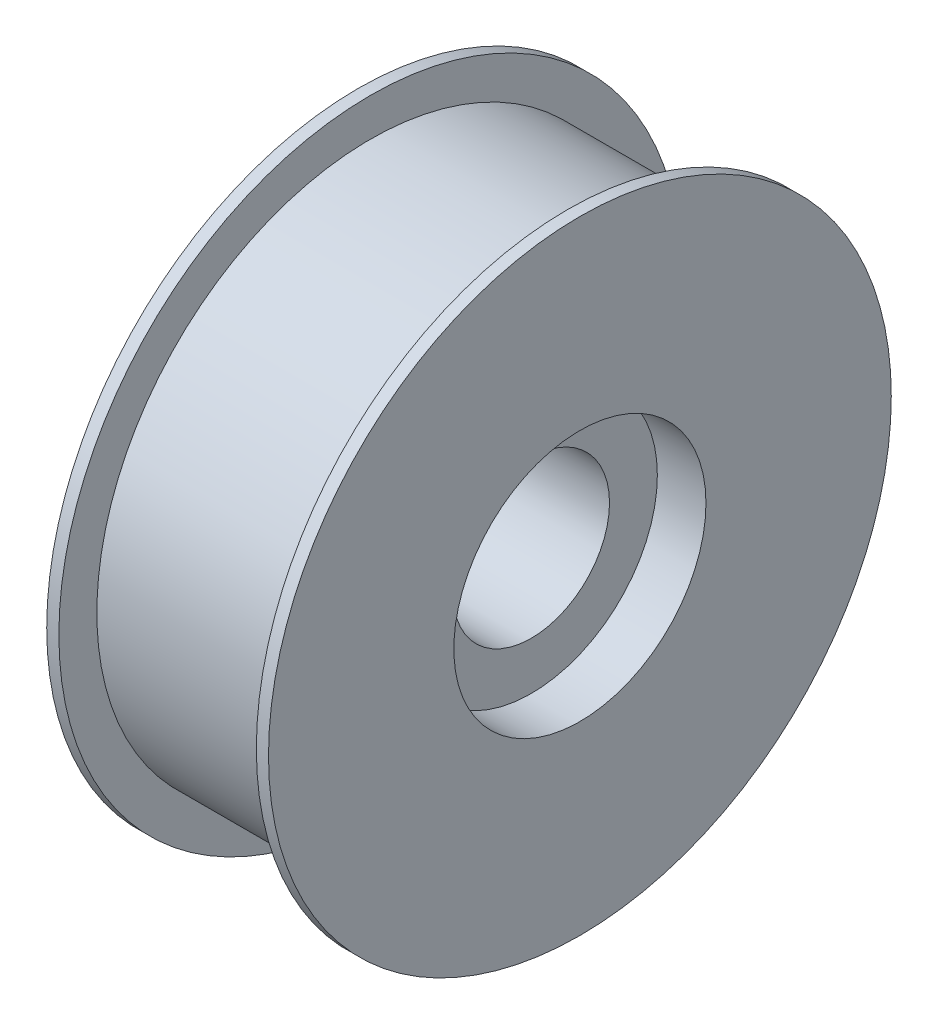
ISO-10303-21;
HEADER;
FILE_DESCRIPTION(('STEP AP214'),'2;1');
FILE_NAME('part.step','',(''),(''),'','','');
FILE_SCHEMA(('AUTOMOTIVE_DESIGN { 1 0 10303 214 1 1 1 1 }'));
ENDSEC;
DATA;
#1=APPLICATION_CONTEXT('core data for automotive mechanical design processes');
#2=APPLICATION_PROTOCOL_DEFINITION('international standard','automotive_design',2000,#1);
#3=PRODUCT_CONTEXT('',#1,'mechanical');
#4=PRODUCT('Part','Part','',(#3));
#5=PRODUCT_RELATED_PRODUCT_CATEGORY('part','',(#4));
#6=PRODUCT_DEFINITION_FORMATION('','',#4);
#7=PRODUCT_DEFINITION_CONTEXT('part definition',#1,'design');
#8=PRODUCT_DEFINITION('design','',#6,#7);
#9=PRODUCT_DEFINITION_SHAPE('','',#8);
#10=(LENGTH_UNIT() NAMED_UNIT(*) SI_UNIT(.MILLI.,.METRE.));
#11=(NAMED_UNIT(*) PLANE_ANGLE_UNIT() SI_UNIT($,.RADIAN.));
#12=(NAMED_UNIT(*) SI_UNIT($,.STERADIAN.) SOLID_ANGLE_UNIT());
#13=UNCERTAINTY_MEASURE_WITH_UNIT(LENGTH_MEASURE(1.E-05),#10,'distance_accuracy_value','');
#14=(GEOMETRIC_REPRESENTATION_CONTEXT(3) GLOBAL_UNCERTAINTY_ASSIGNED_CONTEXT((#13)) GLOBAL_UNIT_ASSIGNED_CONTEXT((#10,
#11,#12)) REPRESENTATION_CONTEXT('',''));
#15=CARTESIAN_POINT('',(0.,0.,0.));
#16=DIRECTION('',(0.,0.,1.));
#17=DIRECTION('',(1.,0.,0.));
#18=AXIS2_PLACEMENT_3D('',#15,#16,#17);
#19=CARTESIAN_POINT('',(36.5,0.,0.));
#20=DIRECTION('',(1.,0.,0.));
#21=DIRECTION('',(0.,0.,-1.));
#22=AXIS2_PLACEMENT_3D('',#19,#20,#21);
#23=CYLINDRICAL_SURFACE('',#22,102.5);
#24=CARTESIAN_POINT('',(4.,0.,0.));
#25=DIRECTION('',(1.,0.,0.));
#26=DIRECTION('',(0.,0.,-1.));
#27=AXIS2_PLACEMENT_3D('',#24,#25,#26);
#28=CIRCLE('',#27,102.5);
#29=CARTESIAN_POINT('',(4.,0.,-102.5));
#30=VERTEX_POINT('',#29);
#31=EDGE_CURVE('E10',#30,#30,#28,.T.);
#32=ORIENTED_EDGE('',*,*,#31,.F.);
#33=EDGE_LOOP('',(#32));
#34=FACE_BOUND('',#33,.T.);
#35=CARTESIAN_POINT('',(0.,0.,0.));
#36=DIRECTION('',(1.,0.,0.));
#37=DIRECTION('',(0.,0.,-1.));
#38=AXIS2_PLACEMENT_3D('',#35,#36,#37);
#39=CIRCLE('',#38,102.5);
#40=CARTESIAN_POINT('',(0.,0.,-102.5));
#41=VERTEX_POINT('',#40);
#42=EDGE_CURVE('E31',#41,#41,#39,.T.);
#43=ORIENTED_EDGE('',*,*,#42,.T.);
#44=EDGE_LOOP('',(#43));
#45=FACE_BOUND('',#44,.T.);
#46=ADVANCED_FACE('F14',(#34,#45),#23,.T.);
#47=CARTESIAN_POINT('',(36.5,0.,0.));
#48=DIRECTION('',(1.,0.,0.));
#49=DIRECTION('',(0.,0.,-1.));
#50=AXIS2_PLACEMENT_3D('',#47,#48,#49);
#51=CYLINDRICAL_SURFACE('',#50,90.);
#52=CARTESIAN_POINT('',(69.,0.,0.));
#53=DIRECTION('',(1.,0.,0.));
#54=DIRECTION('',(0.,0.,-1.));
#55=AXIS2_PLACEMENT_3D('',#52,#53,#54);
#56=CIRCLE('',#55,90.);
#57=CARTESIAN_POINT('',(69.,0.,-90.));
#58=VERTEX_POINT('',#57);
#59=EDGE_CURVE('E22',#58,#58,#56,.T.);
#60=ORIENTED_EDGE('',*,*,#59,.F.);
#61=EDGE_LOOP('',(#60));
#62=FACE_BOUND('',#61,.T.);
#63=CARTESIAN_POINT('',(3.99999999999999,0.,0.));
#64=DIRECTION('',(1.,0.,0.));
#65=DIRECTION('',(0.,0.,-1.));
#66=AXIS2_PLACEMENT_3D('',#63,#64,#65);
#67=CIRCLE('',#66,90.);
#68=CARTESIAN_POINT('',(3.99999999999999,0.,-90.));
#69=VERTEX_POINT('',#68);
#70=EDGE_CURVE('E32',#69,#69,#67,.T.);
#71=ORIENTED_EDGE('',*,*,#70,.T.);
#72=EDGE_LOOP('',(#71));
#73=FACE_BOUND('',#72,.T.);
#74=ADVANCED_FACE('F72',(#62,#73),#51,.T.);
#75=CARTESIAN_POINT('',(36.5,0.,0.));
#76=DIRECTION('',(1.,0.,0.));
#77=DIRECTION('',(0.,0.,-1.));
#78=AXIS2_PLACEMENT_3D('',#75,#76,#77);
#79=CYLINDRICAL_SURFACE('',#78,102.5);
#80=CARTESIAN_POINT('',(73.,0.,0.));
#81=DIRECTION('',(1.,0.,0.));
#82=DIRECTION('',(0.,0.,-1.));
#83=AXIS2_PLACEMENT_3D('',#80,#81,#82);
#84=CIRCLE('',#83,102.5);
#85=CARTESIAN_POINT('',(73.,0.,-102.5));
#86=VERTEX_POINT('',#85);
#87=EDGE_CURVE('E27',#86,#86,#84,.T.);
#88=ORIENTED_EDGE('',*,*,#87,.F.);
#89=EDGE_LOOP('',(#88));
#90=FACE_BOUND('',#89,.T.);
#91=CARTESIAN_POINT('',(69.,0.,0.));
#92=DIRECTION('',(1.,0.,0.));
#93=DIRECTION('',(0.,0.,-1.));
#94=AXIS2_PLACEMENT_3D('',#91,#92,#93);
#95=CIRCLE('',#94,102.5);
#96=CARTESIAN_POINT('',(69.,0.,-102.5));
#97=VERTEX_POINT('',#96);
#98=EDGE_CURVE('E34',#97,#97,#95,.T.);
#99=ORIENTED_EDGE('',*,*,#98,.T.);
#100=EDGE_LOOP('',(#99));
#101=FACE_BOUND('',#100,.T.);
#102=ADVANCED_FACE('F78',(#90,#101),#79,.T.);
#103=CARTESIAN_POINT('',(36.5,0.,0.));
#104=DIRECTION('',(1.,0.,0.));
#105=DIRECTION('',(0.,0.,-1.));
#106=AXIS2_PLACEMENT_3D('',#103,#104,#105);
#107=CYLINDRICAL_SURFACE('',#106,25.75);
#108=CARTESIAN_POINT('',(0.,0.,0.));
#109=DIRECTION('',(1.,0.,0.));
#110=DIRECTION('',(0.,0.,-1.));
#111=AXIS2_PLACEMENT_3D('',#108,#109,#110);
#112=CIRCLE('',#111,25.75);
#113=CARTESIAN_POINT('',(0.,0.,-25.75));
#114=VERTEX_POINT('',#113);
#115=EDGE_CURVE('E41',#114,#114,#112,.T.);
#116=ORIENTED_EDGE('',*,*,#115,.F.);
#117=EDGE_LOOP('',(#116));
#118=FACE_BOUND('',#117,.T.);
#119=CARTESIAN_POINT('',(57.,0.,0.));
#120=DIRECTION('',(1.,0.,0.));
#121=DIRECTION('',(0.,0.,-1.));
#122=AXIS2_PLACEMENT_3D('',#119,#120,#121);
#123=CIRCLE('',#122,25.75);
#124=CARTESIAN_POINT('',(57.,0.,-25.75));
#125=VERTEX_POINT('',#124);
#126=EDGE_CURVE('E45',#125,#125,#123,.T.);
#127=ORIENTED_EDGE('',*,*,#126,.T.);
#128=EDGE_LOOP('',(#127));
#129=FACE_BOUND('',#128,.T.);
#130=ADVANCED_FACE('F85',(#118,#129),#107,.F.);
#131=CARTESIAN_POINT('',(0.,0.,25.75));
#132=DIRECTION('',(1.,0.,0.));
#133=DIRECTION('',(0.,0.,-1.));
#134=AXIS2_PLACEMENT_3D('',#131,#132,#133);
#135=PLANE('',#134);
#136=ORIENTED_EDGE('',*,*,#42,.F.);
#137=EDGE_LOOP('',(#136));
#138=FACE_BOUND('',#137,.T.);
#139=ORIENTED_EDGE('',*,*,#115,.T.);
#140=EDGE_LOOP('',(#139));
#141=FACE_BOUND('',#140,.T.);
#142=ADVANCED_FACE('F89',(#138,#141),#135,.F.);
#143=CARTESIAN_POINT('',(3.99999999999999,0.,102.5));
#144=DIRECTION('',(1.,0.,0.));
#145=DIRECTION('',(0.,0.,-1.));
#146=AXIS2_PLACEMENT_3D('',#143,#144,#145);
#147=PLANE('',#146);
#148=ORIENTED_EDGE('',*,*,#31,.T.);
#149=EDGE_LOOP('',(#148));
#150=FACE_BOUND('',#149,.T.);
#151=ORIENTED_EDGE('',*,*,#70,.F.);
#152=EDGE_LOOP('',(#151));
#153=FACE_BOUND('',#152,.T.);
#154=ADVANCED_FACE('F68',(#150,#153),#147,.T.);
#155=CARTESIAN_POINT('',(69.,0.,102.5));
#156=DIRECTION('',(1.,0.,0.));
#157=DIRECTION('',(0.,0.,-1.));
#158=AXIS2_PLACEMENT_3D('',#155,#156,#157);
#159=PLANE('',#158);
#160=ORIENTED_EDGE('',*,*,#98,.F.);
#161=EDGE_LOOP('',(#160));
#162=FACE_BOUND('',#161,.T.);
#163=ORIENTED_EDGE('',*,*,#59,.T.);
#164=EDGE_LOOP('',(#163));
#165=FACE_BOUND('',#164,.T.);
#166=ADVANCED_FACE('F61',(#162,#165),#159,.F.);
#167=CARTESIAN_POINT('',(73.,0.,25.75));
#168=DIRECTION('',(1.,0.,0.));
#169=DIRECTION('',(0.,0.,-1.));
#170=AXIS2_PLACEMENT_3D('',#167,#168,#169);
#171=PLANE('',#170);
#172=ORIENTED_EDGE('',*,*,#87,.T.);
#173=EDGE_LOOP('',(#172));
#174=FACE_BOUND('',#173,.T.);
#175=CARTESIAN_POINT('',(73.,0.,0.));
#176=DIRECTION('',(1.,0.,0.));
#177=DIRECTION('',(0.,0.,-1.));
#178=AXIS2_PLACEMENT_3D('',#175,#176,#177);
#179=CIRCLE('',#178,41.5);
#180=CARTESIAN_POINT('',(73.,0.,-41.5));
#181=VERTEX_POINT('',#180);
#182=EDGE_CURVE('E38',#181,#181,#179,.T.);
#183=ORIENTED_EDGE('',*,*,#182,.F.);
#184=EDGE_LOOP('',(#183));
#185=FACE_BOUND('',#184,.T.);
#186=ADVANCED_FACE('F57',(#174,#185),#171,.T.);
#187=CARTESIAN_POINT('',(65.,0.,0.));
#188=DIRECTION('',(1.,0.,0.));
#189=DIRECTION('',(0.,0.,-1.));
#190=AXIS2_PLACEMENT_3D('',#187,#188,#189);
#191=CYLINDRICAL_SURFACE('',#190,41.5);
#192=CARTESIAN_POINT('',(57.,0.,0.));
#193=DIRECTION('',(1.,0.,0.));
#194=DIRECTION('',(0.,0.,-1.));
#195=AXIS2_PLACEMENT_3D('',#192,#193,#194);
#196=CIRCLE('',#195,41.5);
#197=CARTESIAN_POINT('',(57.,0.,-41.5));
#198=VERTEX_POINT('',#197);
#199=EDGE_CURVE('E18',#198,#198,#196,.T.);
#200=ORIENTED_EDGE('',*,*,#199,.F.);
#201=EDGE_LOOP('',(#200));
#202=FACE_BOUND('',#201,.T.);
#203=ORIENTED_EDGE('',*,*,#182,.T.);
#204=EDGE_LOOP('',(#203));
#205=FACE_BOUND('',#204,.T.);
#206=ADVANCED_FACE('F54',(#202,#205),#191,.F.);
#207=CARTESIAN_POINT('',(57.,0.,25.75));
#208=DIRECTION('',(1.,0.,0.));
#209=DIRECTION('',(0.,0.,-1.));
#210=AXIS2_PLACEMENT_3D('',#207,#208,#209);
#211=PLANE('',#210);
#212=ORIENTED_EDGE('',*,*,#199,.T.);
#213=EDGE_LOOP('',(#212));
#214=FACE_BOUND('',#213,.T.);
#215=ORIENTED_EDGE('',*,*,#126,.F.);
#216=EDGE_LOOP('',(#215));
#217=FACE_BOUND('',#216,.T.);
#218=ADVANCED_FACE('F16',(#214,#217),#211,.T.);
#219=CLOSED_SHELL('',(#46,#74,#102,#130,#142,#154,#166,#186,#206,#218));
#220=MANIFOLD_SOLID_BREP('B1',#219);
#221=ADVANCED_BREP_SHAPE_REPRESENTATION('',(#18,#220),#14);
#222=SHAPE_DEFINITION_REPRESENTATION(#9,#221);
ENDSEC;
END-ISO-10303-21;
